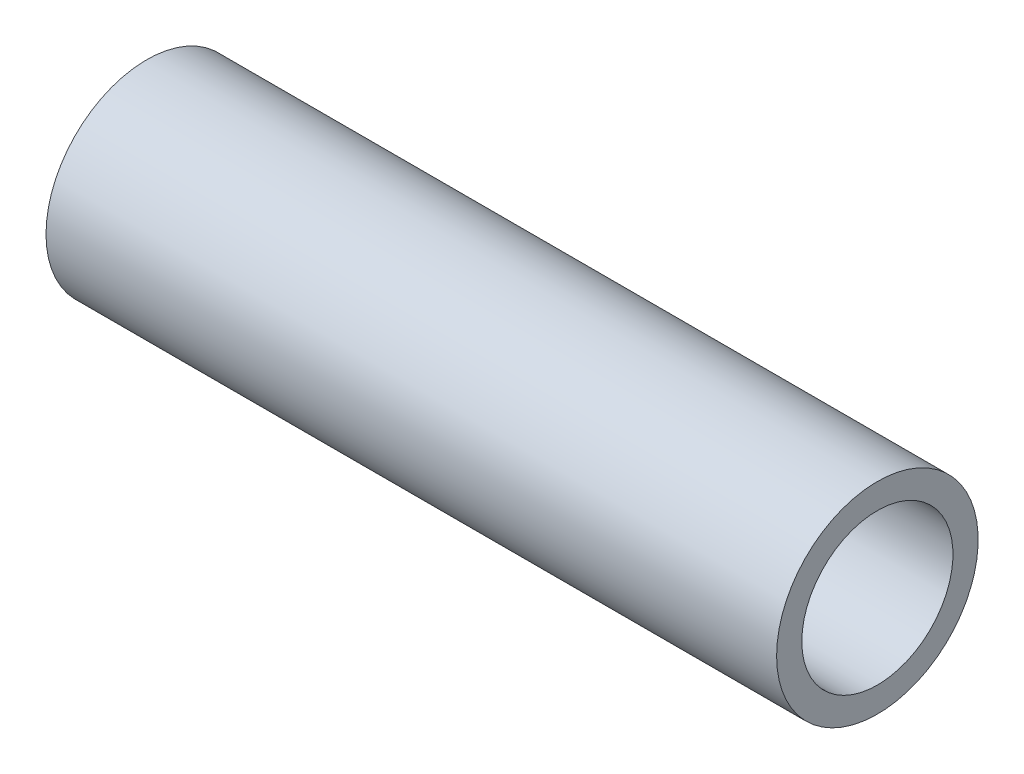
ISO-10303-21;
HEADER;
FILE_DESCRIPTION(('STEP AP214'),'2;1');
FILE_NAME('part.step','',(''),(''),'','','');
FILE_SCHEMA(('AUTOMOTIVE_DESIGN { 1 0 10303 214 1 1 1 1 }'));
ENDSEC;
DATA;
#1=APPLICATION_CONTEXT('core data for automotive mechanical design processes');
#2=APPLICATION_PROTOCOL_DEFINITION('international standard','automotive_design',2000,#1);
#3=PRODUCT_CONTEXT('',#1,'mechanical');
#4=PRODUCT('Part','Part','',(#3));
#5=PRODUCT_RELATED_PRODUCT_CATEGORY('part','',(#4));
#6=PRODUCT_DEFINITION_FORMATION('','',#4);
#7=PRODUCT_DEFINITION_CONTEXT('part definition',#1,'design');
#8=PRODUCT_DEFINITION('design','',#6,#7);
#9=PRODUCT_DEFINITION_SHAPE('','',#8);
#10=(LENGTH_UNIT() NAMED_UNIT(*) SI_UNIT(.MILLI.,.METRE.));
#11=(NAMED_UNIT(*) PLANE_ANGLE_UNIT() SI_UNIT($,.RADIAN.));
#12=(NAMED_UNIT(*) SI_UNIT($,.STERADIAN.) SOLID_ANGLE_UNIT());
#13=UNCERTAINTY_MEASURE_WITH_UNIT(LENGTH_MEASURE(1.E-05),#10,'distance_accuracy_value','');
#14=(GEOMETRIC_REPRESENTATION_CONTEXT(3) GLOBAL_UNCERTAINTY_ASSIGNED_CONTEXT((#13)) GLOBAL_UNIT_ASSIGNED_CONTEXT((#10,
#11,#12)) REPRESENTATION_CONTEXT('',''));
#15=CARTESIAN_POINT('',(0.,0.,0.));
#16=DIRECTION('',(0.,0.,1.));
#17=DIRECTION('',(1.,0.,0.));
#18=AXIS2_PLACEMENT_3D('',#15,#16,#17);
#19=CARTESIAN_POINT('',(167.,21.,35.));
#20=DIRECTION('',(-1.,0.,0.));
#21=DIRECTION('',(0.,0.,1.));
#22=AXIS2_PLACEMENT_3D('',#19,#20,#21);
#23=PLANE('',#22);
#24=CARTESIAN_POINT('',(167.,21.,35.));
#25=DIRECTION('',(-1.,0.,0.));
#26=DIRECTION('',(0.,0.,1.));
#27=AXIS2_PLACEMENT_3D('',#24,#25,#26);
#28=CIRCLE('',#27,3.);
#29=CARTESIAN_POINT('',(167.,21.,38.));
#30=VERTEX_POINT('',#29);
#31=EDGE_CURVE('E65',#30,#30,#28,.T.);
#32=ORIENTED_EDGE('',*,*,#31,.T.);
#33=EDGE_LOOP('',(#32));
#34=FACE_BOUND('',#33,.T.);
#35=CARTESIAN_POINT('',(167.,21.,35.));
#36=DIRECTION('',(-1.,0.,0.));
#37=DIRECTION('',(0.,0.,1.));
#38=AXIS2_PLACEMENT_3D('',#35,#36,#37);
#39=CIRCLE('',#38,4.);
#40=CARTESIAN_POINT('',(167.,21.,39.));
#41=VERTEX_POINT('',#40);
#42=EDGE_CURVE('E51',#41,#41,#39,.T.);
#43=ORIENTED_EDGE('',*,*,#42,.F.);
#44=EDGE_LOOP('',(#43));
#45=FACE_BOUND('',#44,.T.);
#46=ADVANCED_FACE('F50',(#34,#45),#23,.F.);
#47=CARTESIAN_POINT('',(138.,21.,35.));
#48=DIRECTION('',(-1.,0.,0.));
#49=DIRECTION('',(0.,0.,1.));
#50=AXIS2_PLACEMENT_3D('',#47,#48,#49);
#51=PLANE('',#50);
#52=CARTESIAN_POINT('',(138.,21.,35.));
#53=DIRECTION('',(-1.,0.,0.));
#54=DIRECTION('',(0.,0.,1.));
#55=AXIS2_PLACEMENT_3D('',#52,#53,#54);
#56=CIRCLE('',#55,3.);
#57=CARTESIAN_POINT('',(138.,21.,38.));
#58=VERTEX_POINT('',#57);
#59=EDGE_CURVE('E59',#58,#58,#56,.T.);
#60=ORIENTED_EDGE('',*,*,#59,.F.);
#61=EDGE_LOOP('',(#60));
#62=FACE_BOUND('',#61,.T.);
#63=CARTESIAN_POINT('',(138.,21.,35.));
#64=DIRECTION('',(-1.,0.,0.));
#65=DIRECTION('',(0.,0.,1.));
#66=AXIS2_PLACEMENT_3D('',#63,#64,#65);
#67=CIRCLE('',#66,4.);
#68=CARTESIAN_POINT('',(138.,21.,39.));
#69=VERTEX_POINT('',#68);
#70=EDGE_CURVE('E11',#69,#69,#67,.T.);
#71=ORIENTED_EDGE('',*,*,#70,.T.);
#72=EDGE_LOOP('',(#71));
#73=FACE_BOUND('',#72,.T.);
#74=ADVANCED_FACE('F73',(#62,#73),#51,.T.);
#75=CARTESIAN_POINT('',(167.,21.,35.));
#76=DIRECTION('',(-1.,0.,0.));
#77=DIRECTION('',(0.,0.,1.));
#78=AXIS2_PLACEMENT_3D('',#75,#76,#77);
#79=CYLINDRICAL_SURFACE('',#78,4.);
#80=ORIENTED_EDGE('',*,*,#70,.F.);
#81=EDGE_LOOP('',(#80));
#82=FACE_BOUND('',#81,.T.);
#83=ORIENTED_EDGE('',*,*,#42,.T.);
#84=EDGE_LOOP('',(#83));
#85=FACE_BOUND('',#84,.T.);
#86=ADVANCED_FACE('F47',(#82,#85),#79,.T.);
#87=CARTESIAN_POINT('',(167.,21.,35.));
#88=DIRECTION('',(-1.,0.,0.));
#89=DIRECTION('',(0.,0.,1.));
#90=AXIS2_PLACEMENT_3D('',#87,#88,#89);
#91=CYLINDRICAL_SURFACE('',#90,3.);
#92=ORIENTED_EDGE('',*,*,#59,.T.);
#93=EDGE_LOOP('',(#92));
#94=FACE_BOUND('',#93,.T.);
#95=ORIENTED_EDGE('',*,*,#31,.F.);
#96=EDGE_LOOP('',(#95));
#97=FACE_BOUND('',#96,.T.);
#98=ADVANCED_FACE('F68',(#94,#97),#91,.F.);
#99=CLOSED_SHELL('',(#46,#74,#86,#98));
#100=MANIFOLD_SOLID_BREP('B2',#99);
#101=ADVANCED_BREP_SHAPE_REPRESENTATION('',(#18,#100),#14);
#102=SHAPE_DEFINITION_REPRESENTATION(#9,#101);
ENDSEC;
END-ISO-10303-21;
